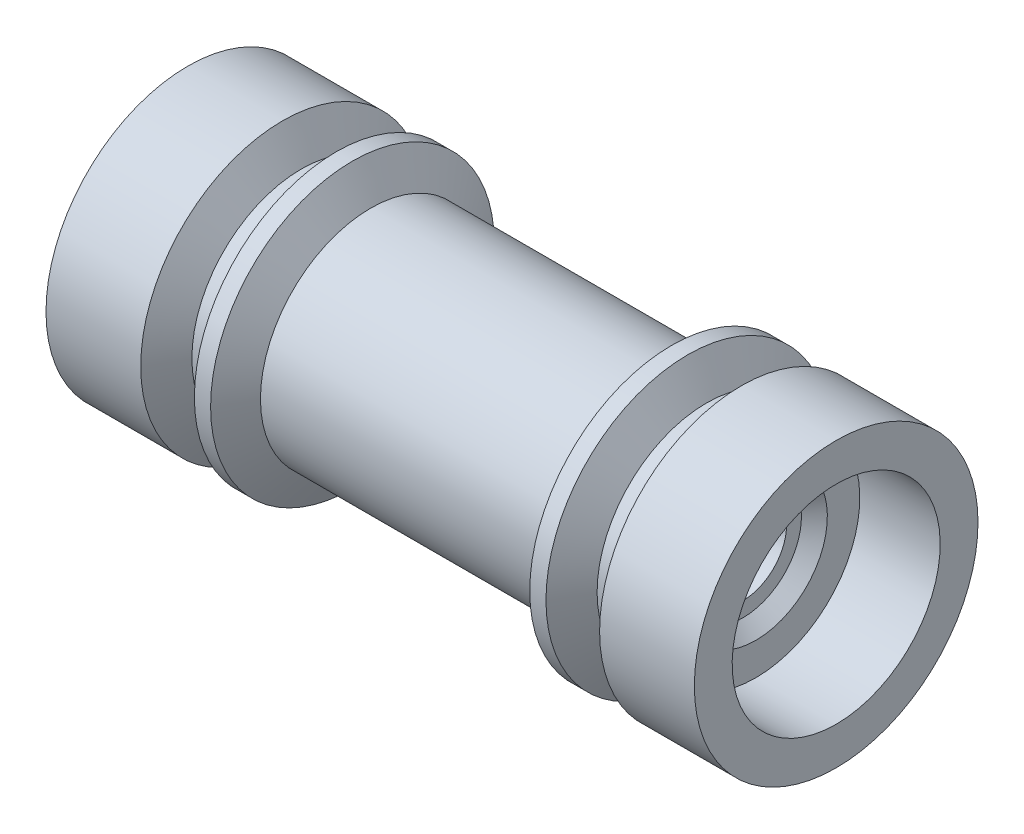
ISO-10303-21;
HEADER;
FILE_DESCRIPTION(('STEP AP214'),'2;1');
FILE_NAME('part.step','',(''),(''),'','','');
FILE_SCHEMA(('AUTOMOTIVE_DESIGN { 1 0 10303 214 1 1 1 1 }'));
ENDSEC;
DATA;
#1=APPLICATION_CONTEXT('core data for automotive mechanical design processes');
#2=APPLICATION_PROTOCOL_DEFINITION('international standard','automotive_design',2000,#1);
#3=PRODUCT_CONTEXT('',#1,'mechanical');
#4=PRODUCT('Part','Part','',(#3));
#5=PRODUCT_RELATED_PRODUCT_CATEGORY('part','',(#4));
#6=PRODUCT_DEFINITION_FORMATION('','',#4);
#7=PRODUCT_DEFINITION_CONTEXT('part definition',#1,'design');
#8=PRODUCT_DEFINITION('design','',#6,#7);
#9=PRODUCT_DEFINITION_SHAPE('','',#8);
#10=(LENGTH_UNIT() NAMED_UNIT(*) SI_UNIT(.MILLI.,.METRE.));
#11=(NAMED_UNIT(*) PLANE_ANGLE_UNIT() SI_UNIT($,.RADIAN.));
#12=(NAMED_UNIT(*) SI_UNIT($,.STERADIAN.) SOLID_ANGLE_UNIT());
#13=UNCERTAINTY_MEASURE_WITH_UNIT(LENGTH_MEASURE(1.E-05),#10,'distance_accuracy_value','');
#14=(GEOMETRIC_REPRESENTATION_CONTEXT(3) GLOBAL_UNCERTAINTY_ASSIGNED_CONTEXT((#13)) GLOBAL_UNIT_ASSIGNED_CONTEXT((#10,
#11,#12)) REPRESENTATION_CONTEXT('',''));
#15=CARTESIAN_POINT('',(0.,0.,0.));
#16=DIRECTION('',(0.,0.,1.));
#17=DIRECTION('',(1.,0.,0.));
#18=AXIS2_PLACEMENT_3D('',#15,#16,#17);
#19=CARTESIAN_POINT('',(-6.25176515812918,0.,0.));
#20=DIRECTION('',(-1.,0.,0.));
#21=DIRECTION('',(0.,-1.,0.));
#22=AXIS2_PLACEMENT_3D('',#19,#20,#21);
#23=CONICAL_SURFACE('',#22,5.55625,1.0471975511966);
#24=CARTESIAN_POINT('',(-5.53686118730513,0.,0.));
#25=DIRECTION('',(-1.,0.,0.));
#26=DIRECTION('',(0.,-1.,0.));
#27=AXIS2_PLACEMENT_3D('',#24,#25,#26);
#28=CIRCLE('',#27,4.318);
#29=CARTESIAN_POINT('',(-5.53686118730513,-4.318,0.));
#30=VERTEX_POINT('',#29);
#31=EDGE_CURVE('E122',#30,#30,#28,.T.);
#32=ORIENTED_EDGE('',*,*,#31,.T.);
#33=EDGE_LOOP('',(#32));
#34=FACE_BOUND('',#33,.T.);
#35=CARTESIAN_POINT('',(-6.25176515812918,0.,0.));
#36=DIRECTION('',(-1.,0.,0.));
#37=DIRECTION('',(0.,-1.,0.));
#38=AXIS2_PLACEMENT_3D('',#35,#36,#37);
#39=CIRCLE('',#38,5.55625);
#40=CARTESIAN_POINT('',(-6.25176515812918,-5.55625,0.));
#41=VERTEX_POINT('',#40);
#42=EDGE_CURVE('E68',#41,#41,#39,.T.);
#43=ORIENTED_EDGE('',*,*,#42,.F.);
#44=EDGE_LOOP('',(#43));
#45=FACE_BOUND('',#44,.T.);
#46=ADVANCED_FACE('F51',(#34,#45),#23,.T.);
#47=CARTESIAN_POINT('',(-12.7,0.,0.));
#48=DIRECTION('',(-1.,0.,0.));
#49=DIRECTION('',(0.,-1.,0.));
#50=AXIS2_PLACEMENT_3D('',#47,#48,#49);
#51=CYLINDRICAL_SURFACE('',#50,5.55625);
#52=ORIENTED_EDGE('',*,*,#42,.T.);
#53=EDGE_LOOP('',(#52));
#54=FACE_BOUND('',#53,.T.);
#55=CARTESIAN_POINT('',(-6.88676515812918,0.,0.));
#56=DIRECTION('',(-1.,0.,0.));
#57=DIRECTION('',(0.,-1.,0.));
#58=AXIS2_PLACEMENT_3D('',#55,#56,#57);
#59=CIRCLE('',#58,5.55625);
#60=CARTESIAN_POINT('',(-6.88676515812918,-5.55625,0.));
#61=VERTEX_POINT('',#60);
#62=EDGE_CURVE('E76',#61,#61,#59,.T.);
#63=ORIENTED_EDGE('',*,*,#62,.F.);
#64=EDGE_LOOP('',(#63));
#65=FACE_BOUND('',#64,.T.);
#66=ADVANCED_FACE('F229',(#54,#65),#51,.T.);
#67=CARTESIAN_POINT('',(-7.62,0.,0.));
#68=DIRECTION('',(1.,0.,0.));
#69=DIRECTION('',(0.,1.,0.));
#70=AXIS2_PLACEMENT_3D('',#67,#68,#69);
#71=CONICAL_SURFACE('',#70,4.28625,1.0471975511966);
#72=ORIENTED_EDGE('',*,*,#62,.T.);
#73=EDGE_LOOP('',(#72));
#74=FACE_BOUND('',#73,.T.);
#75=CARTESIAN_POINT('',(-7.62,0.,0.));
#76=DIRECTION('',(-1.,0.,0.));
#77=DIRECTION('',(0.,-1.,0.));
#78=AXIS2_PLACEMENT_3D('',#75,#76,#77);
#79=CIRCLE('',#78,4.28625);
#80=CARTESIAN_POINT('',(-7.62,-4.28625,0.));
#81=VERTEX_POINT('',#80);
#82=EDGE_CURVE('E82',#81,#81,#79,.T.);
#83=ORIENTED_EDGE('',*,*,#82,.F.);
#84=EDGE_LOOP('',(#83));
#85=FACE_BOUND('',#84,.T.);
#86=ADVANCED_FACE('F233',(#74,#85),#71,.T.);
#87=CARTESIAN_POINT('',(-12.7,0.,0.));
#88=DIRECTION('',(-1.,0.,0.));
#89=DIRECTION('',(0.,-1.,0.));
#90=AXIS2_PLACEMENT_3D('',#87,#88,#89);
#91=CYLINDRICAL_SURFACE('',#90,4.28625);
#92=ORIENTED_EDGE('',*,*,#82,.T.);
#93=EDGE_LOOP('',(#92));
#94=FACE_BOUND('',#93,.T.);
#95=CARTESIAN_POINT('',(-8.255,0.,0.));
#96=DIRECTION('',(-1.,0.,0.));
#97=DIRECTION('',(0.,-1.,0.));
#98=AXIS2_PLACEMENT_3D('',#95,#96,#97);
#99=CIRCLE('',#98,4.28625);
#100=CARTESIAN_POINT('',(-8.255,-4.28625,0.));
#101=VERTEX_POINT('',#100);
#102=EDGE_CURVE('E86',#101,#101,#99,.T.);
#103=ORIENTED_EDGE('',*,*,#102,.F.);
#104=EDGE_LOOP('',(#103));
#105=FACE_BOUND('',#104,.T.);
#106=ADVANCED_FACE('F240',(#94,#105),#91,.T.);
#107=CARTESIAN_POINT('',(-8.98823484187082,0.,0.));
#108=DIRECTION('',(-1.,0.,0.));
#109=DIRECTION('',(0.,-1.,0.));
#110=AXIS2_PLACEMENT_3D('',#107,#108,#109);
#111=CONICAL_SURFACE('',#110,5.55625,1.0471975511966);
#112=ORIENTED_EDGE('',*,*,#102,.T.);
#113=EDGE_LOOP('',(#112));
#114=FACE_BOUND('',#113,.T.);
#115=CARTESIAN_POINT('',(-8.98823484187082,0.,0.));
#116=DIRECTION('',(-1.,0.,0.));
#117=DIRECTION('',(0.,-1.,0.));
#118=AXIS2_PLACEMENT_3D('',#115,#116,#117);
#119=CIRCLE('',#118,5.55625);
#120=CARTESIAN_POINT('',(-8.98823484187082,-5.55625,0.));
#121=VERTEX_POINT('',#120);
#122=EDGE_CURVE('E90',#121,#121,#119,.T.);
#123=ORIENTED_EDGE('',*,*,#122,.F.);
#124=EDGE_LOOP('',(#123));
#125=FACE_BOUND('',#124,.T.);
#126=ADVANCED_FACE('F244',(#114,#125),#111,.T.);
#127=CARTESIAN_POINT('',(-12.7,0.,0.));
#128=DIRECTION('',(-1.,0.,0.));
#129=DIRECTION('',(0.,-1.,0.));
#130=AXIS2_PLACEMENT_3D('',#127,#128,#129);
#131=CYLINDRICAL_SURFACE('',#130,5.55625);
#132=ORIENTED_EDGE('',*,*,#122,.T.);
#133=EDGE_LOOP('',(#132));
#134=FACE_BOUND('',#133,.T.);
#135=CARTESIAN_POINT('',(-12.7,0.,0.));
#136=DIRECTION('',(-1.,0.,0.));
#137=DIRECTION('',(0.,-1.,0.));
#138=AXIS2_PLACEMENT_3D('',#135,#136,#137);
#139=CIRCLE('',#138,5.55625);
#140=CARTESIAN_POINT('',(-12.7,-5.55625,0.));
#141=VERTEX_POINT('',#140);
#142=EDGE_CURVE('E94',#141,#141,#139,.T.);
#143=ORIENTED_EDGE('',*,*,#142,.F.);
#144=EDGE_LOOP('',(#143));
#145=FACE_BOUND('',#144,.T.);
#146=ADVANCED_FACE('F248',(#134,#145),#131,.T.);
#147=CARTESIAN_POINT('',(-12.7,0.,0.));
#148=DIRECTION('',(1.,0.,0.));
#149=DIRECTION('',(0.,1.,0.));
#150=AXIS2_PLACEMENT_3D('',#147,#148,#149);
#151=PLANE('',#150);
#152=CARTESIAN_POINT('',(-12.7,0.,0.));
#153=DIRECTION('',(1.,0.,0.));
#154=DIRECTION('',(0.,1.,0.));
#155=AXIS2_PLACEMENT_3D('',#152,#153,#154);
#156=CIRCLE('',#155,4.58300000000001);
#157=CARTESIAN_POINT('',(-12.7,4.58300000000001,0.));
#158=VERTEX_POINT('',#157);
#159=EDGE_CURVE('E10',#158,#158,#156,.T.);
#160=ORIENTED_EDGE('',*,*,#159,.T.);
#161=EDGE_LOOP('',(#160));
#162=FACE_BOUND('',#161,.T.);
#163=ORIENTED_EDGE('',*,*,#142,.T.);
#164=EDGE_LOOP('',(#163));
#165=FACE_BOUND('',#164,.T.);
#166=ADVANCED_FACE('F252',(#162,#165),#151,.F.);
#167=CARTESIAN_POINT('',(-12.7,0.,0.));
#168=DIRECTION('',(-1.,0.,0.));
#169=DIRECTION('',(0.,-1.,0.));
#170=AXIS2_PLACEMENT_3D('',#167,#168,#169);
#171=CYLINDRICAL_SURFACE('',#170,4.075);
#172=CARTESIAN_POINT('',(-12.192,0.,0.));
#173=DIRECTION('',(1.,0.,0.));
#174=DIRECTION('',(0.,1.,0.));
#175=AXIS2_PLACEMENT_3D('',#172,#173,#174);
#176=CIRCLE('',#175,4.075);
#177=CARTESIAN_POINT('',(-12.192,4.075,0.));
#178=VERTEX_POINT('',#177);
#179=EDGE_CURVE('E60',#178,#178,#176,.F.);
#180=ORIENTED_EDGE('',*,*,#179,.T.);
#181=EDGE_LOOP('',(#180));
#182=FACE_BOUND('',#181,.T.);
#183=CARTESIAN_POINT('',(-9.55,0.,0.));
#184=DIRECTION('',(-1.,0.,0.));
#185=DIRECTION('',(0.,-1.,0.));
#186=AXIS2_PLACEMENT_3D('',#183,#184,#185);
#187=CIRCLE('',#186,4.075);
#188=CARTESIAN_POINT('',(-9.55,-4.075,0.));
#189=VERTEX_POINT('',#188);
#190=EDGE_CURVE('E98',#189,#189,#187,.T.);
#191=ORIENTED_EDGE('',*,*,#190,.F.);
#192=EDGE_LOOP('',(#191));
#193=FACE_BOUND('',#192,.T.);
#194=ADVANCED_FACE('F256',(#182,#193),#171,.F.);
#195=CARTESIAN_POINT('',(-9.55,0.,0.));
#196=DIRECTION('',(1.,0.,0.));
#197=DIRECTION('',(0.,1.,0.));
#198=AXIS2_PLACEMENT_3D('',#195,#196,#197);
#199=PLANE('',#198);
#200=CARTESIAN_POINT('',(-9.55,0.,0.));
#201=DIRECTION('',(-1.,0.,0.));
#202=DIRECTION('',(0.,-1.,0.));
#203=AXIS2_PLACEMENT_3D('',#200,#201,#202);
#204=CIRCLE('',#203,2.805);
#205=CARTESIAN_POINT('',(-9.55,-2.805,0.));
#206=VERTEX_POINT('',#205);
#207=EDGE_CURVE('E102',#206,#206,#204,.T.);
#208=ORIENTED_EDGE('',*,*,#207,.F.);
#209=EDGE_LOOP('',(#208));
#210=FACE_BOUND('',#209,.T.);
#211=ORIENTED_EDGE('',*,*,#190,.T.);
#212=EDGE_LOOP('',(#211));
#213=FACE_BOUND('',#212,.T.);
#214=ADVANCED_FACE('F259',(#210,#213),#199,.F.);
#215=CARTESIAN_POINT('',(-9.55,0.,0.));
#216=DIRECTION('',(-1.,0.,0.));
#217=DIRECTION('',(0.,-1.,0.));
#218=AXIS2_PLACEMENT_3D('',#215,#216,#217);
#219=CONICAL_SURFACE('',#218,2.805,0.785398163397445);
#220=CARTESIAN_POINT('',(-9.042,0.,0.));
#221=DIRECTION('',(-1.,0.,0.));
#222=DIRECTION('',(0.,-1.,0.));
#223=AXIS2_PLACEMENT_3D('',#220,#221,#222);
#224=CIRCLE('',#223,2.297);
#225=CARTESIAN_POINT('',(-9.042,-2.297,0.));
#226=VERTEX_POINT('',#225);
#227=EDGE_CURVE('E106',#226,#226,#224,.T.);
#228=ORIENTED_EDGE('',*,*,#227,.F.);
#229=EDGE_LOOP('',(#228));
#230=FACE_BOUND('',#229,.T.);
#231=ORIENTED_EDGE('',*,*,#207,.T.);
#232=EDGE_LOOP('',(#231));
#233=FACE_BOUND('',#232,.T.);
#234=ADVANCED_FACE('F262',(#230,#233),#219,.F.);
#235=CARTESIAN_POINT('',(-9.042,0.,0.));
#236=DIRECTION('',(1.,0.,0.));
#237=DIRECTION('',(0.,1.,0.));
#238=AXIS2_PLACEMENT_3D('',#235,#236,#237);
#239=PLANE('',#238);
#240=CARTESIAN_POINT('',(-9.042,0.,0.));
#241=DIRECTION('',(-1.,0.,0.));
#242=DIRECTION('',(0.,-1.,0.));
#243=AXIS2_PLACEMENT_3D('',#240,#241,#242);
#244=CIRCLE('',#243,1.7145);
#245=CARTESIAN_POINT('',(-9.042,-1.7145,0.));
#246=VERTEX_POINT('',#245);
#247=EDGE_CURVE('E110',#246,#246,#244,.T.);
#248=ORIENTED_EDGE('',*,*,#247,.F.);
#249=EDGE_LOOP('',(#248));
#250=FACE_BOUND('',#249,.T.);
#251=ORIENTED_EDGE('',*,*,#227,.T.);
#252=EDGE_LOOP('',(#251));
#253=FACE_BOUND('',#252,.T.);
#254=ADVANCED_FACE('F266',(#250,#253),#239,.F.);
#255=CARTESIAN_POINT('',(-12.7,0.,0.));
#256=DIRECTION('',(-1.,0.,0.));
#257=DIRECTION('',(0.,-1.,0.));
#258=AXIS2_PLACEMENT_3D('',#255,#256,#257);
#259=CYLINDRICAL_SURFACE('',#258,1.7145);
#260=CARTESIAN_POINT('',(-2.875,0.,0.));
#261=DIRECTION('',(-1.,0.,0.));
#262=DIRECTION('',(0.,-1.,0.));
#263=AXIS2_PLACEMENT_3D('',#260,#261,#262);
#264=CIRCLE('',#263,1.7145);
#265=CARTESIAN_POINT('',(-2.875,-1.7145,0.));
#266=VERTEX_POINT('',#265);
#267=EDGE_CURVE('E114',#266,#266,#264,.T.);
#268=ORIENTED_EDGE('',*,*,#267,.F.);
#269=EDGE_LOOP('',(#268));
#270=FACE_BOUND('',#269,.T.);
#271=ORIENTED_EDGE('',*,*,#247,.T.);
#272=EDGE_LOOP('',(#271));
#273=FACE_BOUND('',#272,.T.);
#274=ADVANCED_FACE('F270',(#270,#273),#259,.F.);
#275=CARTESIAN_POINT('',(-2.875,0.,0.));
#276=DIRECTION('',(1.,0.,0.));
#277=DIRECTION('',(0.,1.,0.));
#278=AXIS2_PLACEMENT_3D('',#275,#276,#277);
#279=PLANE('',#278);
#280=CARTESIAN_POINT('',(-2.875,0.,0.));
#281=DIRECTION('',(-1.,0.,0.));
#282=DIRECTION('',(0.,-1.,0.));
#283=AXIS2_PLACEMENT_3D('',#280,#281,#282);
#284=CIRCLE('',#283,1.6);
#285=CARTESIAN_POINT('',(-2.875,-1.6,0.));
#286=VERTEX_POINT('',#285);
#287=EDGE_CURVE('E118',#286,#286,#284,.T.);
#288=ORIENTED_EDGE('',*,*,#287,.F.);
#289=EDGE_LOOP('',(#288));
#290=FACE_BOUND('',#289,.T.);
#291=ORIENTED_EDGE('',*,*,#267,.T.);
#292=EDGE_LOOP('',(#291));
#293=FACE_BOUND('',#292,.T.);
#294=ADVANCED_FACE('F274',(#290,#293),#279,.F.);
#295=CARTESIAN_POINT('',(-12.7,0.,0.));
#296=DIRECTION('',(-1.,0.,0.));
#297=DIRECTION('',(0.,-1.,0.));
#298=AXIS2_PLACEMENT_3D('',#295,#296,#297);
#299=CYLINDRICAL_SURFACE('',#298,1.6);
#300=ORIENTED_EDGE('',*,*,#287,.T.);
#301=EDGE_LOOP('',(#300));
#302=FACE_BOUND('',#301,.T.);
#303=CARTESIAN_POINT('',(2.875,0.,0.));
#304=DIRECTION('',(-1.,0.,0.));
#305=DIRECTION('',(0.,-1.,0.));
#306=AXIS2_PLACEMENT_3D('',#303,#304,#305);
#307=CIRCLE('',#306,1.6);
#308=CARTESIAN_POINT('',(2.875,-1.6,0.));
#309=VERTEX_POINT('',#308);
#310=EDGE_CURVE('E170',#309,#309,#307,.T.);
#311=ORIENTED_EDGE('',*,*,#310,.F.);
#312=EDGE_LOOP('',(#311));
#313=FACE_BOUND('',#312,.T.);
#314=ADVANCED_FACE('F278',(#302,#313),#299,.F.);
#315=CARTESIAN_POINT('',(-12.7,0.,0.));
#316=DIRECTION('',(-1.,0.,0.));
#317=DIRECTION('',(0.,-1.,0.));
#318=AXIS2_PLACEMENT_3D('',#315,#316,#317);
#319=CYLINDRICAL_SURFACE('',#318,4.318);
#320=ORIENTED_EDGE('',*,*,#31,.F.);
#321=EDGE_LOOP('',(#320));
#322=FACE_BOUND('',#321,.T.);
#323=CARTESIAN_POINT('',(5.53686118730513,0.,0.));
#324=DIRECTION('',(-1.,0.,0.));
#325=DIRECTION('',(0.,-1.,0.));
#326=AXIS2_PLACEMENT_3D('',#323,#324,#325);
#327=CIRCLE('',#326,4.318);
#328=CARTESIAN_POINT('',(5.53686118730513,-4.318,0.));
#329=VERTEX_POINT('',#328);
#330=EDGE_CURVE('E174',#329,#329,#327,.T.);
#331=ORIENTED_EDGE('',*,*,#330,.T.);
#332=EDGE_LOOP('',(#331));
#333=FACE_BOUND('',#332,.T.);
#334=ADVANCED_FACE('F180',(#322,#333),#319,.T.);
#335=CARTESIAN_POINT('',(6.25176515812918,0.,0.));
#336=DIRECTION('',(1.,0.,0.));
#337=DIRECTION('',(0.,-1.,0.));
#338=AXIS2_PLACEMENT_3D('',#335,#336,#337);
#339=CONICAL_SURFACE('',#338,5.55625,1.0471975511966);
#340=ORIENTED_EDGE('',*,*,#330,.F.);
#341=EDGE_LOOP('',(#340));
#342=FACE_BOUND('',#341,.T.);
#343=CARTESIAN_POINT('',(6.25176515812918,0.,0.));
#344=DIRECTION('',(-1.,0.,0.));
#345=DIRECTION('',(0.,-1.,0.));
#346=AXIS2_PLACEMENT_3D('',#343,#344,#345);
#347=CIRCLE('',#346,5.55625);
#348=CARTESIAN_POINT('',(6.25176515812918,-5.55625,0.));
#349=VERTEX_POINT('',#348);
#350=EDGE_CURVE('E126',#349,#349,#347,.T.);
#351=ORIENTED_EDGE('',*,*,#350,.T.);
#352=EDGE_LOOP('',(#351));
#353=FACE_BOUND('',#352,.T.);
#354=ADVANCED_FACE('F182',(#342,#353),#339,.T.);
#355=CARTESIAN_POINT('',(12.7,0.,0.));
#356=DIRECTION('',(1.,0.,0.));
#357=DIRECTION('',(0.,-1.,0.));
#358=AXIS2_PLACEMENT_3D('',#355,#356,#357);
#359=CYLINDRICAL_SURFACE('',#358,5.55625);
#360=ORIENTED_EDGE('',*,*,#350,.F.);
#361=EDGE_LOOP('',(#360));
#362=FACE_BOUND('',#361,.T.);
#363=CARTESIAN_POINT('',(6.88676515812918,0.,0.));
#364=DIRECTION('',(-1.,0.,0.));
#365=DIRECTION('',(0.,-1.,0.));
#366=AXIS2_PLACEMENT_3D('',#363,#364,#365);
#367=CIRCLE('',#366,5.55625);
#368=CARTESIAN_POINT('',(6.88676515812918,-5.55625,0.));
#369=VERTEX_POINT('',#368);
#370=EDGE_CURVE('E130',#369,#369,#367,.T.);
#371=ORIENTED_EDGE('',*,*,#370,.T.);
#372=EDGE_LOOP('',(#371));
#373=FACE_BOUND('',#372,.T.);
#374=ADVANCED_FACE('F185',(#362,#373),#359,.T.);
#375=CARTESIAN_POINT('',(7.62,0.,0.));
#376=DIRECTION('',(-1.,0.,0.));
#377=DIRECTION('',(0.,1.,0.));
#378=AXIS2_PLACEMENT_3D('',#375,#376,#377);
#379=CONICAL_SURFACE('',#378,4.28625,1.0471975511966);
#380=ORIENTED_EDGE('',*,*,#370,.F.);
#381=EDGE_LOOP('',(#380));
#382=FACE_BOUND('',#381,.T.);
#383=CARTESIAN_POINT('',(7.62,0.,0.));
#384=DIRECTION('',(-1.,0.,0.));
#385=DIRECTION('',(0.,-1.,0.));
#386=AXIS2_PLACEMENT_3D('',#383,#384,#385);
#387=CIRCLE('',#386,4.28625);
#388=CARTESIAN_POINT('',(7.62,-4.28625,0.));
#389=VERTEX_POINT('',#388);
#390=EDGE_CURVE('E134',#389,#389,#387,.T.);
#391=ORIENTED_EDGE('',*,*,#390,.T.);
#392=EDGE_LOOP('',(#391));
#393=FACE_BOUND('',#392,.T.);
#394=ADVANCED_FACE('F191',(#382,#393),#379,.T.);
#395=CARTESIAN_POINT('',(12.7,0.,0.));
#396=DIRECTION('',(1.,0.,0.));
#397=DIRECTION('',(0.,-1.,0.));
#398=AXIS2_PLACEMENT_3D('',#395,#396,#397);
#399=CYLINDRICAL_SURFACE('',#398,4.28625);
#400=ORIENTED_EDGE('',*,*,#390,.F.);
#401=EDGE_LOOP('',(#400));
#402=FACE_BOUND('',#401,.T.);
#403=CARTESIAN_POINT('',(8.255,0.,0.));
#404=DIRECTION('',(-1.,0.,0.));
#405=DIRECTION('',(0.,-1.,0.));
#406=AXIS2_PLACEMENT_3D('',#403,#404,#405);
#407=CIRCLE('',#406,4.28625);
#408=CARTESIAN_POINT('',(8.255,-4.28625,0.));
#409=VERTEX_POINT('',#408);
#410=EDGE_CURVE('E138',#409,#409,#407,.T.);
#411=ORIENTED_EDGE('',*,*,#410,.T.);
#412=EDGE_LOOP('',(#411));
#413=FACE_BOUND('',#412,.T.);
#414=ADVANCED_FACE('F197',(#402,#413),#399,.T.);
#415=CARTESIAN_POINT('',(8.98823484187082,0.,0.));
#416=DIRECTION('',(1.,0.,0.));
#417=DIRECTION('',(0.,-1.,0.));
#418=AXIS2_PLACEMENT_3D('',#415,#416,#417);
#419=CONICAL_SURFACE('',#418,5.55625,1.0471975511966);
#420=ORIENTED_EDGE('',*,*,#410,.F.);
#421=EDGE_LOOP('',(#420));
#422=FACE_BOUND('',#421,.T.);
#423=CARTESIAN_POINT('',(8.98823484187082,0.,0.));
#424=DIRECTION('',(-1.,0.,0.));
#425=DIRECTION('',(0.,-1.,0.));
#426=AXIS2_PLACEMENT_3D('',#423,#424,#425);
#427=CIRCLE('',#426,5.55625);
#428=CARTESIAN_POINT('',(8.98823484187082,-5.55625,0.));
#429=VERTEX_POINT('',#428);
#430=EDGE_CURVE('E142',#429,#429,#427,.T.);
#431=ORIENTED_EDGE('',*,*,#430,.T.);
#432=EDGE_LOOP('',(#431));
#433=FACE_BOUND('',#432,.T.);
#434=ADVANCED_FACE('F203',(#422,#433),#419,.T.);
#435=CARTESIAN_POINT('',(12.7,0.,0.));
#436=DIRECTION('',(1.,0.,0.));
#437=DIRECTION('',(0.,-1.,0.));
#438=AXIS2_PLACEMENT_3D('',#435,#436,#437);
#439=CYLINDRICAL_SURFACE('',#438,5.55625);
#440=ORIENTED_EDGE('',*,*,#430,.F.);
#441=EDGE_LOOP('',(#440));
#442=FACE_BOUND('',#441,.T.);
#443=CARTESIAN_POINT('',(12.7,0.,0.));
#444=DIRECTION('',(-1.,0.,0.));
#445=DIRECTION('',(0.,-1.,0.));
#446=AXIS2_PLACEMENT_3D('',#443,#444,#445);
#447=CIRCLE('',#446,5.55625);
#448=CARTESIAN_POINT('',(12.7,-5.55625,0.));
#449=VERTEX_POINT('',#448);
#450=EDGE_CURVE('E146',#449,#449,#447,.T.);
#451=ORIENTED_EDGE('',*,*,#450,.T.);
#452=EDGE_LOOP('',(#451));
#453=FACE_BOUND('',#452,.T.);
#454=ADVANCED_FACE('F209',(#442,#453),#439,.T.);
#455=CARTESIAN_POINT('',(12.7,0.,0.));
#456=DIRECTION('',(-1.,0.,0.));
#457=DIRECTION('',(0.,1.,0.));
#458=AXIS2_PLACEMENT_3D('',#455,#456,#457);
#459=PLANE('',#458);
#460=CARTESIAN_POINT('',(12.7,0.,0.));
#461=DIRECTION('',(-1.,0.,0.));
#462=DIRECTION('',(0.,-1.,0.));
#463=AXIS2_PLACEMENT_3D('',#460,#461,#462);
#464=CIRCLE('',#463,4.075);
#465=CARTESIAN_POINT('',(12.7,-4.075,0.));
#466=VERTEX_POINT('',#465);
#467=EDGE_CURVE('E150',#466,#466,#464,.T.);
#468=ORIENTED_EDGE('',*,*,#467,.T.);
#469=EDGE_LOOP('',(#468));
#470=FACE_BOUND('',#469,.T.);
#471=ORIENTED_EDGE('',*,*,#450,.F.);
#472=EDGE_LOOP('',(#471));
#473=FACE_BOUND('',#472,.T.);
#474=ADVANCED_FACE('F215',(#470,#473),#459,.F.);
#475=CARTESIAN_POINT('',(12.7,0.,0.));
#476=DIRECTION('',(1.,0.,0.));
#477=DIRECTION('',(0.,-1.,0.));
#478=AXIS2_PLACEMENT_3D('',#475,#476,#477);
#479=CYLINDRICAL_SURFACE('',#478,4.075);
#480=CARTESIAN_POINT('',(9.55,0.,0.));
#481=DIRECTION('',(-1.,0.,0.));
#482=DIRECTION('',(0.,-1.,0.));
#483=AXIS2_PLACEMENT_3D('',#480,#481,#482);
#484=CIRCLE('',#483,4.075);
#485=CARTESIAN_POINT('',(9.55,-4.075,0.));
#486=VERTEX_POINT('',#485);
#487=EDGE_CURVE('E154',#486,#486,#484,.T.);
#488=ORIENTED_EDGE('',*,*,#487,.T.);
#489=EDGE_LOOP('',(#488));
#490=FACE_BOUND('',#489,.T.);
#491=ORIENTED_EDGE('',*,*,#467,.F.);
#492=EDGE_LOOP('',(#491));
#493=FACE_BOUND('',#492,.T.);
#494=ADVANCED_FACE('F220',(#490,#493),#479,.F.);
#495=CARTESIAN_POINT('',(9.55,0.,0.));
#496=DIRECTION('',(-1.,0.,0.));
#497=DIRECTION('',(0.,1.,0.));
#498=AXIS2_PLACEMENT_3D('',#495,#496,#497);
#499=PLANE('',#498);
#500=CARTESIAN_POINT('',(9.55,0.,0.));
#501=DIRECTION('',(-1.,0.,0.));
#502=DIRECTION('',(0.,-1.,0.));
#503=AXIS2_PLACEMENT_3D('',#500,#501,#502);
#504=CIRCLE('',#503,2.805);
#505=CARTESIAN_POINT('',(9.55,-2.805,0.));
#506=VERTEX_POINT('',#505);
#507=EDGE_CURVE('E157',#506,#506,#504,.T.);
#508=ORIENTED_EDGE('',*,*,#507,.T.);
#509=EDGE_LOOP('',(#508));
#510=FACE_BOUND('',#509,.T.);
#511=ORIENTED_EDGE('',*,*,#487,.F.);
#512=EDGE_LOOP('',(#511));
#513=FACE_BOUND('',#512,.T.);
#514=ADVANCED_FACE('F225',(#510,#513),#499,.F.);
#515=CARTESIAN_POINT('',(9.55,0.,0.));
#516=DIRECTION('',(1.,0.,0.));
#517=DIRECTION('',(0.,-1.,0.));
#518=AXIS2_PLACEMENT_3D('',#515,#516,#517);
#519=CONICAL_SURFACE('',#518,2.805,0.785398163397445);
#520=CARTESIAN_POINT('',(9.042,0.,0.));
#521=DIRECTION('',(-1.,0.,0.));
#522=DIRECTION('',(0.,-1.,0.));
#523=AXIS2_PLACEMENT_3D('',#520,#521,#522);
#524=CIRCLE('',#523,2.297);
#525=CARTESIAN_POINT('',(9.042,-2.297,0.));
#526=VERTEX_POINT('',#525);
#527=EDGE_CURVE('E160',#526,#526,#524,.T.);
#528=ORIENTED_EDGE('',*,*,#527,.T.);
#529=EDGE_LOOP('',(#528));
#530=FACE_BOUND('',#529,.T.);
#531=ORIENTED_EDGE('',*,*,#507,.F.);
#532=EDGE_LOOP('',(#531));
#533=FACE_BOUND('',#532,.T.);
#534=ADVANCED_FACE('F327',(#530,#533),#519,.F.);
#535=CARTESIAN_POINT('',(9.042,0.,0.));
#536=DIRECTION('',(-1.,0.,0.));
#537=DIRECTION('',(0.,1.,0.));
#538=AXIS2_PLACEMENT_3D('',#535,#536,#537);
#539=PLANE('',#538);
#540=CARTESIAN_POINT('',(9.042,0.,0.));
#541=DIRECTION('',(-1.,0.,0.));
#542=DIRECTION('',(0.,-1.,0.));
#543=AXIS2_PLACEMENT_3D('',#540,#541,#542);
#544=CIRCLE('',#543,1.7145);
#545=CARTESIAN_POINT('',(9.042,-1.7145,0.));
#546=VERTEX_POINT('',#545);
#547=EDGE_CURVE('E163',#546,#546,#544,.T.);
#548=ORIENTED_EDGE('',*,*,#547,.T.);
#549=EDGE_LOOP('',(#548));
#550=FACE_BOUND('',#549,.T.);
#551=ORIENTED_EDGE('',*,*,#527,.F.);
#552=EDGE_LOOP('',(#551));
#553=FACE_BOUND('',#552,.T.);
#554=ADVANCED_FACE('F337',(#550,#553),#539,.F.);
#555=CARTESIAN_POINT('',(12.7,0.,0.));
#556=DIRECTION('',(1.,0.,0.));
#557=DIRECTION('',(0.,-1.,0.));
#558=AXIS2_PLACEMENT_3D('',#555,#556,#557);
#559=CYLINDRICAL_SURFACE('',#558,1.7145);
#560=CARTESIAN_POINT('',(2.875,0.,0.));
#561=DIRECTION('',(-1.,0.,0.));
#562=DIRECTION('',(0.,-1.,0.));
#563=AXIS2_PLACEMENT_3D('',#560,#561,#562);
#564=CIRCLE('',#563,1.7145);
#565=CARTESIAN_POINT('',(2.875,-1.7145,0.));
#566=VERTEX_POINT('',#565);
#567=EDGE_CURVE('E166',#566,#566,#564,.T.);
#568=ORIENTED_EDGE('',*,*,#567,.T.);
#569=EDGE_LOOP('',(#568));
#570=FACE_BOUND('',#569,.T.);
#571=ORIENTED_EDGE('',*,*,#547,.F.);
#572=EDGE_LOOP('',(#571));
#573=FACE_BOUND('',#572,.T.);
#574=ADVANCED_FACE('F347',(#570,#573),#559,.F.);
#575=CARTESIAN_POINT('',(2.875,0.,0.));
#576=DIRECTION('',(-1.,0.,0.));
#577=DIRECTION('',(0.,1.,0.));
#578=AXIS2_PLACEMENT_3D('',#575,#576,#577);
#579=PLANE('',#578);
#580=ORIENTED_EDGE('',*,*,#310,.T.);
#581=EDGE_LOOP('',(#580));
#582=FACE_BOUND('',#581,.T.);
#583=ORIENTED_EDGE('',*,*,#567,.F.);
#584=EDGE_LOOP('',(#583));
#585=FACE_BOUND('',#584,.T.);
#586=ADVANCED_FACE('F357',(#582,#585),#579,.F.);
#587=CARTESIAN_POINT('',(-12.192,0.,0.));
#588=DIRECTION('',(-1.,0.,0.));
#589=DIRECTION('',(0.,-1.,0.));
#590=AXIS2_PLACEMENT_3D('',#587,#588,#589);
#591=CONICAL_SURFACE('',#590,4.075,0.785398163397452);
#592=ORIENTED_EDGE('',*,*,#159,.F.);
#593=EDGE_LOOP('',(#592));
#594=FACE_BOUND('',#593,.T.);
#595=ORIENTED_EDGE('',*,*,#179,.F.);
#596=EDGE_LOOP('',(#595));
#597=FACE_BOUND('',#596,.T.);
#598=ADVANCED_FACE('F54',(#594,#597),#591,.F.);
#599=CLOSED_SHELL('',(#46,#66,#86,#106,#126,#146,#166,#194,#214,#234,#254,#274,#294,#314,#334,
#354,#374,#394,#414,#434,#454,#474,#494,#514,#534,#554,#574,#586,#598));
#600=MANIFOLD_SOLID_BREP('B2',#599);
#601=ADVANCED_BREP_SHAPE_REPRESENTATION('',(#18,#600),#14);
#602=SHAPE_DEFINITION_REPRESENTATION(#9,#601);
ENDSEC;
END-ISO-10303-21;
